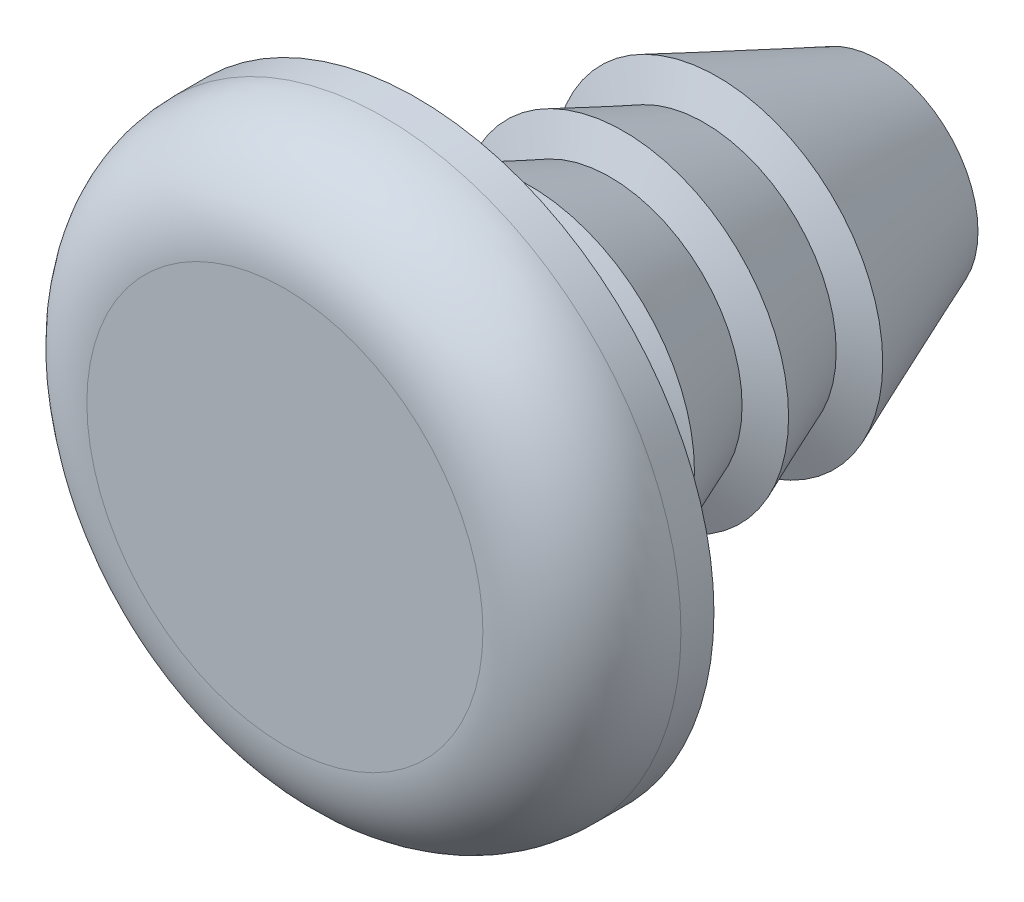
ISO-10303-21;
HEADER;
FILE_DESCRIPTION(('STEP AP214'),'2;1');
FILE_NAME('part.step','',(''),(''),'','','');
FILE_SCHEMA(('AUTOMOTIVE_DESIGN { 1 0 10303 214 1 1 1 1 }'));
ENDSEC;
DATA;
#1=APPLICATION_CONTEXT('core data for automotive mechanical design processes');
#2=APPLICATION_PROTOCOL_DEFINITION('international standard','automotive_design',2000,#1);
#3=PRODUCT_CONTEXT('',#1,'mechanical');
#4=PRODUCT('Part','Part','',(#3));
#5=PRODUCT_RELATED_PRODUCT_CATEGORY('part','',(#4));
#6=PRODUCT_DEFINITION_FORMATION('','',#4);
#7=PRODUCT_DEFINITION_CONTEXT('part definition',#1,'design');
#8=PRODUCT_DEFINITION('design','',#6,#7);
#9=PRODUCT_DEFINITION_SHAPE('','',#8);
#10=(LENGTH_UNIT() NAMED_UNIT(*) SI_UNIT(.MILLI.,.METRE.));
#11=(NAMED_UNIT(*) PLANE_ANGLE_UNIT() SI_UNIT($,.RADIAN.));
#12=(NAMED_UNIT(*) SI_UNIT($,.STERADIAN.) SOLID_ANGLE_UNIT());
#13=UNCERTAINTY_MEASURE_WITH_UNIT(LENGTH_MEASURE(1.E-05),#10,'distance_accuracy_value','');
#14=(GEOMETRIC_REPRESENTATION_CONTEXT(3) GLOBAL_UNCERTAINTY_ASSIGNED_CONTEXT((#13)) GLOBAL_UNIT_ASSIGNED_CONTEXT((#10,
#11,#12)) REPRESENTATION_CONTEXT('',''));
#15=CARTESIAN_POINT('',(0.,0.,0.));
#16=DIRECTION('',(0.,0.,1.));
#17=DIRECTION('',(1.,0.,0.));
#18=AXIS2_PLACEMENT_3D('',#15,#16,#17);
#19=CARTESIAN_POINT('',(0.,4.5,0.));
#20=DIRECTION('',(0.,0.,1.));
#21=DIRECTION('',(1.,0.,0.));
#22=AXIS2_PLACEMENT_3D('',#19,#20,#21);
#23=PLANE('',#22);
#24=CARTESIAN_POINT('',(0.,0.,0.));
#25=DIRECTION('',(0.,0.,1.));
#26=DIRECTION('',(1.,0.,0.));
#27=AXIS2_PLACEMENT_3D('',#24,#25,#26);
#28=CIRCLE('',#27,4.5);
#29=CARTESIAN_POINT('',(4.5,0.,0.));
#30=VERTEX_POINT('',#29);
#31=EDGE_CURVE('E70',#30,#30,#28,.T.);
#32=ORIENTED_EDGE('',*,*,#31,.F.);
#33=EDGE_LOOP('',(#32));
#34=FACE_BOUND('',#33,.T.);
#35=CARTESIAN_POINT('',(0.,0.,0.));
#36=DIRECTION('',(0.,0.,1.));
#37=DIRECTION('',(1.,0.,0.));
#38=AXIS2_PLACEMENT_3D('',#35,#36,#37);
#39=CIRCLE('',#38,2.);
#40=CARTESIAN_POINT('',(2.,0.,0.));
#41=VERTEX_POINT('',#40);
#42=EDGE_CURVE('E10',#41,#41,#39,.T.);
#43=ORIENTED_EDGE('',*,*,#42,.T.);
#44=EDGE_LOOP('',(#43));
#45=FACE_BOUND('',#44,.T.);
#46=ADVANCED_FACE('F33',(#34,#45),#23,.F.);
#47=CARTESIAN_POINT('',(0.,0.,35.672992326613));
#48=DIRECTION('',(0.,0.,1.));
#49=DIRECTION('',(1.,0.,0.));
#50=AXIS2_PLACEMENT_3D('',#47,#48,#49);
#51=CYLINDRICAL_SURFACE('',#50,2.);
#52=ORIENTED_EDGE('',*,*,#42,.F.);
#53=EDGE_LOOP('',(#52));
#54=FACE_BOUND('',#53,.T.);
#55=CARTESIAN_POINT('',(0.,0.,-1.5));
#56=DIRECTION('',(0.,0.,1.));
#57=DIRECTION('',(1.,0.,0.));
#58=AXIS2_PLACEMENT_3D('',#55,#56,#57);
#59=CIRCLE('',#58,2.);
#60=CARTESIAN_POINT('',(2.,0.,-1.5));
#61=VERTEX_POINT('',#60);
#62=EDGE_CURVE('E39',#61,#61,#59,.T.);
#63=ORIENTED_EDGE('',*,*,#62,.T.);
#64=EDGE_LOOP('',(#63));
#65=FACE_BOUND('',#64,.T.);
#66=ADVANCED_FACE('F77',(#54,#65),#51,.T.);
#67=CARTESIAN_POINT('',(0.,0.,-1.70466635455687));
#68=DIRECTION('',(0.,0.,-1.));
#69=DIRECTION('',(-1.,0.,0.));
#70=AXIS2_PLACEMENT_3D('',#67,#68,#69);
#71=CONICAL_SURFACE('',#70,2.5,1.18227049128908);
#72=ORIENTED_EDGE('',*,*,#62,.F.);
#73=EDGE_LOOP('',(#72));
#74=FACE_BOUND('',#73,.T.);
#75=CARTESIAN_POINT('',(0.,0.,-1.70466635455687));
#76=DIRECTION('',(0.,0.,1.));
#77=DIRECTION('',(1.,0.,0.));
#78=AXIS2_PLACEMENT_3D('',#75,#76,#77);
#79=CIRCLE('',#78,2.5);
#80=CARTESIAN_POINT('',(2.5,0.,-1.70466635455687));
#81=VERTEX_POINT('',#80);
#82=EDGE_CURVE('E43',#81,#81,#79,.T.);
#83=ORIENTED_EDGE('',*,*,#82,.T.);
#84=EDGE_LOOP('',(#83));
#85=FACE_BOUND('',#84,.T.);
#86=ADVANCED_FACE('F81',(#74,#85),#71,.T.);
#87=CARTESIAN_POINT('',(0.,0.,-2.92616658863921));
#88=DIRECTION('',(0.,0.,1.));
#89=DIRECTION('',(1.,0.,0.));
#90=AXIS2_PLACEMENT_3D('',#87,#88,#89);
#91=CONICAL_SURFACE('',#90,2.,0.388525835505822);
#92=ORIENTED_EDGE('',*,*,#82,.F.);
#93=EDGE_LOOP('',(#92));
#94=FACE_BOUND('',#93,.T.);
#95=CARTESIAN_POINT('',(0.,0.,-2.92616658863921));
#96=DIRECTION('',(0.,0.,1.));
#97=DIRECTION('',(1.,0.,0.));
#98=AXIS2_PLACEMENT_3D('',#95,#96,#97);
#99=CIRCLE('',#98,2.);
#100=CARTESIAN_POINT('',(2.,0.,-2.92616658863921));
#101=VERTEX_POINT('',#100);
#102=EDGE_CURVE('E47',#101,#101,#99,.T.);
#103=ORIENTED_EDGE('',*,*,#102,.T.);
#104=EDGE_LOOP('',(#103));
#105=FACE_BOUND('',#104,.T.);
#106=ADVANCED_FACE('F86',(#94,#105),#91,.T.);
#107=CARTESIAN_POINT('',(0.,0.,-3.13083294319609));
#108=DIRECTION('',(0.,0.,-1.));
#109=DIRECTION('',(-1.,0.,0.));
#110=AXIS2_PLACEMENT_3D('',#107,#108,#109);
#111=CONICAL_SURFACE('',#110,2.5,1.18227049128907);
#112=ORIENTED_EDGE('',*,*,#102,.F.);
#113=EDGE_LOOP('',(#112));
#114=FACE_BOUND('',#113,.T.);
#115=CARTESIAN_POINT('',(0.,0.,-3.13083294319609));
#116=DIRECTION('',(0.,0.,1.));
#117=DIRECTION('',(1.,0.,0.));
#118=AXIS2_PLACEMENT_3D('',#115,#116,#117);
#119=CIRCLE('',#118,2.5);
#120=CARTESIAN_POINT('',(2.5,0.,-3.13083294319609));
#121=VERTEX_POINT('',#120);
#122=EDGE_CURVE('E52',#121,#121,#119,.T.);
#123=ORIENTED_EDGE('',*,*,#122,.T.);
#124=EDGE_LOOP('',(#123));
#125=FACE_BOUND('',#124,.T.);
#126=ADVANCED_FACE('F92',(#114,#125),#111,.T.);
#127=CARTESIAN_POINT('',(0.,0.,-4.35233317727844));
#128=DIRECTION('',(0.,0.,1.));
#129=DIRECTION('',(1.,0.,0.));
#130=AXIS2_PLACEMENT_3D('',#127,#128,#129);
#131=CONICAL_SURFACE('',#130,2.,0.388525835505822);
#132=ORIENTED_EDGE('',*,*,#122,.F.);
#133=EDGE_LOOP('',(#132));
#134=FACE_BOUND('',#133,.T.);
#135=CARTESIAN_POINT('',(0.,0.,-4.35233317727844));
#136=DIRECTION('',(0.,0.,1.));
#137=DIRECTION('',(1.,0.,0.));
#138=AXIS2_PLACEMENT_3D('',#135,#136,#137);
#139=CIRCLE('',#138,2.);
#140=CARTESIAN_POINT('',(2.,0.,-4.35233317727844));
#141=VERTEX_POINT('',#140);
#142=EDGE_CURVE('E55',#141,#141,#139,.T.);
#143=ORIENTED_EDGE('',*,*,#142,.T.);
#144=EDGE_LOOP('',(#143));
#145=FACE_BOUND('',#144,.T.);
#146=ADVANCED_FACE('F96',(#134,#145),#131,.T.);
#147=CARTESIAN_POINT('',(0.,0.,-4.55699953183531));
#148=DIRECTION('',(0.,0.,-1.));
#149=DIRECTION('',(-1.,0.,0.));
#150=AXIS2_PLACEMENT_3D('',#147,#148,#149);
#151=CONICAL_SURFACE('',#150,2.5,1.18227049128907);
#152=ORIENTED_EDGE('',*,*,#142,.F.);
#153=EDGE_LOOP('',(#152));
#154=FACE_BOUND('',#153,.T.);
#155=CARTESIAN_POINT('',(0.,0.,-4.55699953183531));
#156=DIRECTION('',(0.,0.,1.));
#157=DIRECTION('',(1.,0.,0.));
#158=AXIS2_PLACEMENT_3D('',#155,#156,#157);
#159=CIRCLE('',#158,2.5);
#160=CARTESIAN_POINT('',(2.5,0.,-4.55699953183531));
#161=VERTEX_POINT('',#160);
#162=EDGE_CURVE('E58',#161,#161,#159,.T.);
#163=ORIENTED_EDGE('',*,*,#162,.T.);
#164=EDGE_LOOP('',(#163));
#165=FACE_BOUND('',#164,.T.);
#166=ADVANCED_FACE('F100',(#154,#165),#151,.T.);
#167=CARTESIAN_POINT('',(0.,0.,-7.));
#168=DIRECTION('',(0.,0.,1.));
#169=DIRECTION('',(1.,0.,0.));
#170=AXIS2_PLACEMENT_3D('',#167,#168,#169);
#171=CONICAL_SURFACE('',#170,1.5,0.388525835505822);
#172=ORIENTED_EDGE('',*,*,#162,.F.);
#173=EDGE_LOOP('',(#172));
#174=FACE_BOUND('',#173,.T.);
#175=CARTESIAN_POINT('',(0.,0.,-7.));
#176=DIRECTION('',(0.,0.,1.));
#177=DIRECTION('',(1.,0.,0.));
#178=AXIS2_PLACEMENT_3D('',#175,#176,#177);
#179=CIRCLE('',#178,1.5);
#180=CARTESIAN_POINT('',(1.5,0.,-7.));
#181=VERTEX_POINT('',#180);
#182=EDGE_CURVE('E61',#181,#181,#179,.T.);
#183=ORIENTED_EDGE('',*,*,#182,.T.);
#184=EDGE_LOOP('',(#183));
#185=FACE_BOUND('',#184,.T.);
#186=ADVANCED_FACE('F104',(#174,#185),#171,.T.);
#187=CARTESIAN_POINT('',(0.,1.5,-7.));
#188=DIRECTION('',(0.,0.,1.));
#189=DIRECTION('',(1.,0.,0.));
#190=AXIS2_PLACEMENT_3D('',#187,#188,#189);
#191=PLANE('',#190);
#192=ORIENTED_EDGE('',*,*,#182,.F.);
#193=EDGE_LOOP('',(#192));
#194=FACE_BOUND('',#193,.T.);
#195=ADVANCED_FACE('F108',(#194),#191,.F.);
#196=CARTESIAN_POINT('',(0.,2.99999999999999,2.));
#197=DIRECTION('',(0.,0.,-1.));
#198=DIRECTION('',(-1.,0.,0.));
#199=AXIS2_PLACEMENT_3D('',#196,#197,#198);
#200=PLANE('',#199);
#201=CARTESIAN_POINT('',(0.,0.,2.));
#202=DIRECTION('',(0.,0.,1.));
#203=DIRECTION('',(1.,0.,0.));
#204=AXIS2_PLACEMENT_3D('',#201,#202,#203);
#205=CIRCLE('',#204,2.99999999999999);
#206=CARTESIAN_POINT('',(2.99999999999999,0.,2.));
#207=VERTEX_POINT('',#206);
#208=EDGE_CURVE('E64',#207,#207,#205,.T.);
#209=ORIENTED_EDGE('',*,*,#208,.T.);
#210=EDGE_LOOP('',(#209));
#211=FACE_BOUND('',#210,.T.);
#212=ADVANCED_FACE('F112',(#211),#200,.F.);
#213=CARTESIAN_POINT('',(0.,0.,0.5));
#214=DIRECTION('',(0.,0.,1.));
#215=DIRECTION('',(1.,0.,0.));
#216=AXIS2_PLACEMENT_3D('',#213,#214,#215);
#217=TOROIDAL_SURFACE('',#216,3.,1.5);
#218=ORIENTED_EDGE('',*,*,#208,.F.);
#219=EDGE_LOOP('',(#218));
#220=FACE_BOUND('',#219,.T.);
#221=CARTESIAN_POINT('',(0.,0.,0.499999999999987));
#222=DIRECTION('',(0.,0.,1.));
#223=DIRECTION('',(1.,0.,0.));
#224=AXIS2_PLACEMENT_3D('',#221,#222,#223);
#225=CIRCLE('',#224,4.5);
#226=CARTESIAN_POINT('',(4.5,0.,0.499999999999987));
#227=VERTEX_POINT('',#226);
#228=EDGE_CURVE('E67',#227,#227,#225,.T.);
#229=ORIENTED_EDGE('',*,*,#228,.T.);
#230=EDGE_LOOP('',(#229));
#231=FACE_BOUND('',#230,.T.);
#232=ADVANCED_FACE('F116',(#220,#231),#217,.T.);
#233=CARTESIAN_POINT('',(0.,0.,35.672992326613));
#234=DIRECTION('',(0.,0.,1.));
#235=DIRECTION('',(1.,0.,0.));
#236=AXIS2_PLACEMENT_3D('',#233,#234,#235);
#237=CYLINDRICAL_SURFACE('',#236,4.5);
#238=ORIENTED_EDGE('',*,*,#228,.F.);
#239=EDGE_LOOP('',(#238));
#240=FACE_BOUND('',#239,.T.);
#241=ORIENTED_EDGE('',*,*,#31,.T.);
#242=EDGE_LOOP('',(#241));
#243=FACE_BOUND('',#242,.T.);
#244=ADVANCED_FACE('F74',(#240,#243),#237,.T.);
#245=CLOSED_SHELL('',(#46,#66,#86,#106,#126,#146,#166,#186,#195,#212,#232,#244));
#246=MANIFOLD_SOLID_BREP('B2',#245);
#247=ADVANCED_BREP_SHAPE_REPRESENTATION('',(#18,#246),#14);
#248=SHAPE_DEFINITION_REPRESENTATION(#9,#247);
ENDSEC;
END-ISO-10303-21;
